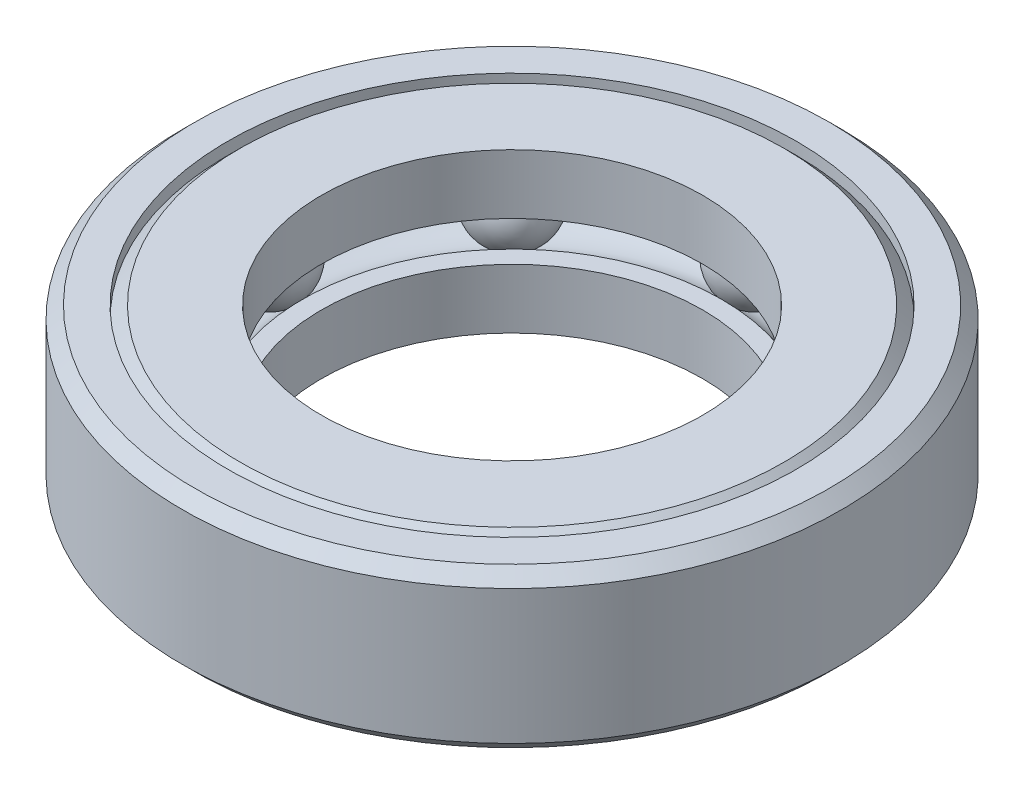
ISO-10303-21;
HEADER;
FILE_DESCRIPTION(('STEP AP214'),'2;1');
FILE_NAME('part.step','',(''),(''),'','','');
FILE_SCHEMA(('AUTOMOTIVE_DESIGN { 1 0 10303 214 1 1 1 1 }'));
ENDSEC;
DATA;
#1=APPLICATION_CONTEXT('core data for automotive mechanical design processes');
#2=APPLICATION_PROTOCOL_DEFINITION('international standard','automotive_design',2000,#1);
#3=PRODUCT_CONTEXT('',#1,'mechanical');
#4=PRODUCT('Part','Part','',(#3));
#5=PRODUCT_RELATED_PRODUCT_CATEGORY('part','',(#4));
#6=PRODUCT_DEFINITION_FORMATION('','',#4);
#7=PRODUCT_DEFINITION_CONTEXT('part definition',#1,'design');
#8=PRODUCT_DEFINITION('design','',#6,#7);
#9=PRODUCT_DEFINITION_SHAPE('','',#8);
#10=(LENGTH_UNIT() NAMED_UNIT(*) SI_UNIT(.MILLI.,.METRE.));
#11=(NAMED_UNIT(*) PLANE_ANGLE_UNIT() SI_UNIT($,.RADIAN.));
#12=(NAMED_UNIT(*) SI_UNIT($,.STERADIAN.) SOLID_ANGLE_UNIT());
#13=UNCERTAINTY_MEASURE_WITH_UNIT(LENGTH_MEASURE(1.E-05),#10,'distance_accuracy_value','');
#14=(GEOMETRIC_REPRESENTATION_CONTEXT(3) GLOBAL_UNCERTAINTY_ASSIGNED_CONTEXT((#13)) GLOBAL_UNIT_ASSIGNED_CONTEXT((#10,
#11,#12)) REPRESENTATION_CONTEXT('',''));
#15=CARTESIAN_POINT('',(0.,0.,0.));
#16=DIRECTION('',(0.,0.,1.));
#17=DIRECTION('',(1.,0.,0.));
#18=AXIS2_PLACEMENT_3D('',#15,#16,#17);
#19=CARTESIAN_POINT('',(17.2168347821121,0.,17.2168347821125));
#20=DIRECTION('',(0.,1.,0.));
#21=DIRECTION('',(-0.707106781186539,0.,-0.707106781186556));
#22=AXIS2_PLACEMENT_3D('',#19,#20,#21);
#23=SPHERICAL_SURFACE('',#22,3.96875);
#24=CARTESIAN_POINT('',(17.2168347821121,3.96875,17.2168347821125));
#25=VERTEX_POINT('',#24);
#26=VERTEX_LOOP('',#25);
#27=FACE_BOUND('',#26,.T.);
#28=ADVANCED_FACE('F38',(#27),#23,.T.);
#29=CLOSED_SHELL('',(#28));
#30=MANIFOLD_SOLID_BREP('B2',#29);
#31=CARTESIAN_POINT('',(24.34828125,0.,2.55034708851837E-13));
#32=DIRECTION('',(0.,1.,0.));
#33=DIRECTION('',(-1.,0.,0.));
#34=AXIS2_PLACEMENT_3D('',#31,#32,#33);
#35=SPHERICAL_SURFACE('',#34,3.96875);
#36=CARTESIAN_POINT('',(24.34828125,3.96875,2.55520740550249E-13));
#37=VERTEX_POINT('',#36);
#38=VERTEX_LOOP('',#37);
#39=FACE_BOUND('',#38,.T.);
#40=ADVANCED_FACE('F57',(#39),#35,.T.);
#41=CLOSED_SHELL('',(#40));
#42=MANIFOLD_SOLID_BREP('B6',#41);
#43=CARTESIAN_POINT('',(17.2168347821124,0.,-17.2168347821121));
#44=DIRECTION('',(0.,1.,0.));
#45=DIRECTION('',(-0.707106781186554,0.,0.707106781186541));
#46=AXIS2_PLACEMENT_3D('',#43,#44,#45);
#47=SPHERICAL_SURFACE('',#46,3.96875);
#48=CARTESIAN_POINT('',(17.2168347821124,3.96875000000001,-17.2168347821121));
#49=VERTEX_POINT('',#48);
#50=VERTEX_LOOP('',#49);
#51=FACE_BOUND('',#50,.T.);
#52=ADVANCED_FACE('F76',(#51),#47,.T.);
#53=CLOSED_SHELL('',(#52));
#54=MANIFOLD_SOLID_BREP('B34',#53);
#55=CARTESIAN_POINT('',(0.,0.,-24.34828125));
#56=DIRECTION('',(0.,1.,0.));
#57=DIRECTION('',(0.,0.,1.));
#58=AXIS2_PLACEMENT_3D('',#55,#56,#57);
#59=SPHERICAL_SURFACE('',#58,3.96875);
#60=CARTESIAN_POINT('',(0.,3.96875000000001,-24.34828125));
#61=VERTEX_POINT('',#60);
#62=VERTEX_LOOP('',#61);
#63=FACE_BOUND('',#62,.T.);
#64=ADVANCED_FACE('F95',(#63),#59,.T.);
#65=CLOSED_SHELL('',(#64));
#66=MANIFOLD_SOLID_BREP('B53',#65);
#67=CARTESIAN_POINT('',(-17.2168347821122,0.,-17.2168347821124));
#68=DIRECTION('',(0.,1.,0.));
#69=DIRECTION('',(0.707106781186544,0.,0.707106781186551));
#70=AXIS2_PLACEMENT_3D('',#67,#68,#69);
#71=SPHERICAL_SURFACE('',#70,3.96875);
#72=CARTESIAN_POINT('',(-17.2168347821122,3.96875000000001,-17.2168347821124));
#73=VERTEX_POINT('',#72);
#74=VERTEX_LOOP('',#73);
#75=FACE_BOUND('',#74,.T.);
#76=ADVANCED_FACE('F114',(#75),#71,.T.);
#77=CLOSED_SHELL('',(#76));
#78=MANIFOLD_SOLID_BREP('B72',#77);
#79=CARTESIAN_POINT('',(-24.34828125,0.,0.));
#80=DIRECTION('',(0.,1.,0.));
#81=DIRECTION('',(1.,0.,0.));
#82=AXIS2_PLACEMENT_3D('',#79,#80,#81);
#83=SPHERICAL_SURFACE('',#82,3.96875);
#84=CARTESIAN_POINT('',(-24.34828125,3.96875,0.));
#85=VERTEX_POINT('',#84);
#86=VERTEX_LOOP('',#85);
#87=FACE_BOUND('',#86,.T.);
#88=ADVANCED_FACE('F133',(#87),#83,.T.);
#89=CLOSED_SHELL('',(#88));
#90=MANIFOLD_SOLID_BREP('B91',#89);
#91=CARTESIAN_POINT('',(-17.2168347821123,0.,17.2168347821122));
#92=DIRECTION('',(0.,1.,0.));
#93=DIRECTION('',(0.707106781186549,0.,-0.707106781186546));
#94=AXIS2_PLACEMENT_3D('',#91,#92,#93);
#95=SPHERICAL_SURFACE('',#94,3.96875);
#96=CARTESIAN_POINT('',(-17.2168347821123,3.96875,17.2168347821122));
#97=VERTEX_POINT('',#96);
#98=VERTEX_LOOP('',#97);
#99=FACE_BOUND('',#98,.T.);
#100=ADVANCED_FACE('F152',(#99),#95,.T.);
#101=CLOSED_SHELL('',(#100));
#102=MANIFOLD_SOLID_BREP('B110',#101);
#103=CARTESIAN_POINT('',(0.,0.,24.34828125));
#104=DIRECTION('',(0.,1.,0.));
#105=DIRECTION('',(0.,0.,-1.));
#106=AXIS2_PLACEMENT_3D('',#103,#104,#105);
#107=SPHERICAL_SURFACE('',#106,3.96875);
#108=CARTESIAN_POINT('',(0.,3.96875,24.34828125));
#109=VERTEX_POINT('',#108);
#110=VERTEX_LOOP('',#109);
#111=FACE_BOUND('',#110,.T.);
#112=ADVANCED_FACE('F173',(#111),#107,.T.);
#113=CLOSED_SHELL('',(#112));
#114=MANIFOLD_SOLID_BREP('B129',#113);
#115=CARTESIAN_POINT('',(0.,5.47163488649767,0.));
#116=DIRECTION('',(0.,-1.,0.));
#117=DIRECTION('',(0.,0.,-1.));
#118=AXIS2_PLACEMENT_3D('',#115,#116,#117);
#119=CONICAL_SURFACE('',#118,29.6465625,0.785398163397453);
#120=CARTESIAN_POINT('',(0.,6.70456744324884,0.));
#121=DIRECTION('',(0.,-1.,0.));
#122=DIRECTION('',(0.,0.,-1.));
#123=AXIS2_PLACEMENT_3D('',#120,#121,#122);
#124=CIRCLE('',#123,28.4136299432488);
#125=CARTESIAN_POINT('',(0.,6.70456744324884,-28.4136299432488));
#126=VERTEX_POINT('',#125);
#127=EDGE_CURVE('E172',#126,#126,#124,.T.);
#128=ORIENTED_EDGE('',*,*,#127,.F.);
#129=EDGE_LOOP('',(#128));
#130=FACE_BOUND('',#129,.T.);
#131=CARTESIAN_POINT('',(0.,5.47163488649767,0.));
#132=DIRECTION('',(0.,-1.,0.));
#133=DIRECTION('',(0.,0.,-1.));
#134=AXIS2_PLACEMENT_3D('',#131,#132,#133);
#135=CIRCLE('',#134,29.6465625);
#136=CARTESIAN_POINT('',(0.,5.47163488649768,-29.6465625));
#137=VERTEX_POINT('',#136);
#138=EDGE_CURVE('E228',#137,#137,#135,.T.);
#139=ORIENTED_EDGE('',*,*,#138,.T.);
#140=EDGE_LOOP('',(#139));
#141=FACE_BOUND('',#140,.T.);
#142=ADVANCED_FACE('F194',(#130,#141),#119,.F.);
#143=CARTESIAN_POINT('',(0.,-7.9375,0.));
#144=DIRECTION('',(0.,-1.,0.));
#145=DIRECTION('',(0.,0.,-1.));
#146=AXIS2_PLACEMENT_3D('',#143,#144,#145);
#147=CYLINDRICAL_SURFACE('',#146,28.4136299432488);
#148=CARTESIAN_POINT('',(0.,7.9375,0.));
#149=DIRECTION('',(0.,-1.,0.));
#150=DIRECTION('',(0.,0.,-1.));
#151=AXIS2_PLACEMENT_3D('',#148,#149,#150);
#152=CIRCLE('',#151,28.4136299432488);
#153=CARTESIAN_POINT('',(0.,7.93750000000001,-28.4136299432488));
#154=VERTEX_POINT('',#153);
#155=EDGE_CURVE('E200',#154,#154,#152,.T.);
#156=ORIENTED_EDGE('',*,*,#155,.F.);
#157=EDGE_LOOP('',(#156));
#158=FACE_BOUND('',#157,.T.);
#159=ORIENTED_EDGE('',*,*,#127,.T.);
#160=EDGE_LOOP('',(#159));
#161=FACE_BOUND('',#160,.T.);
#162=ADVANCED_FACE('F277',(#158,#161),#147,.F.);
#163=CARTESIAN_POINT('',(0.,7.9375,31.7076924432488));
#164=DIRECTION('',(0.,-1.,0.));
#165=DIRECTION('',(0.,0.,-1.));
#166=AXIS2_PLACEMENT_3D('',#163,#164,#165);
#167=PLANE('',#166);
#168=CARTESIAN_POINT('',(0.,7.9375,0.));
#169=DIRECTION('',(0.,-1.,0.));
#170=DIRECTION('',(0.,0.,-1.));
#171=AXIS2_PLACEMENT_3D('',#168,#169,#170);
#172=CIRCLE('',#171,31.7076924432488);
#173=CARTESIAN_POINT('',(0.,7.93750000000001,-31.7076924432488));
#174=VERTEX_POINT('',#173);
#175=EDGE_CURVE('E204',#174,#174,#172,.T.);
#176=ORIENTED_EDGE('',*,*,#175,.F.);
#177=EDGE_LOOP('',(#176));
#178=FACE_BOUND('',#177,.T.);
#179=ORIENTED_EDGE('',*,*,#155,.T.);
#180=EDGE_LOOP('',(#179));
#181=FACE_BOUND('',#180,.T.);
#182=ADVANCED_FACE('F272',(#178,#181),#167,.F.);
#183=CARTESIAN_POINT('',(0.,7.9375,0.));
#184=DIRECTION('',(0.,-1.,0.));
#185=DIRECTION('',(0.,0.,-1.));
#186=AXIS2_PLACEMENT_3D('',#183,#184,#185);
#187=CONICAL_SURFACE('',#186,31.7076924432488,0.785398163397452);
#188=CARTESIAN_POINT('',(0.,6.70456744324884,0.));
#189=DIRECTION('',(0.,-1.,0.));
#190=DIRECTION('',(0.,0.,-1.));
#191=AXIS2_PLACEMENT_3D('',#188,#189,#190);
#192=CIRCLE('',#191,32.940625);
#193=CARTESIAN_POINT('',(0.,6.70456744324884,-32.940625));
#194=VERTEX_POINT('',#193);
#195=EDGE_CURVE('E208',#194,#194,#192,.T.);
#196=ORIENTED_EDGE('',*,*,#195,.F.);
#197=EDGE_LOOP('',(#196));
#198=FACE_BOUND('',#197,.T.);
#199=ORIENTED_EDGE('',*,*,#175,.T.);
#200=EDGE_LOOP('',(#199));
#201=FACE_BOUND('',#200,.T.);
#202=ADVANCED_FACE('F266',(#198,#201),#187,.T.);
#203=CARTESIAN_POINT('',(0.,-7.9375,0.));
#204=DIRECTION('',(0.,-1.,0.));
#205=DIRECTION('',(0.,0.,-1.));
#206=AXIS2_PLACEMENT_3D('',#203,#204,#205);
#207=CYLINDRICAL_SURFACE('',#206,32.940625);
#208=CARTESIAN_POINT('',(0.,-6.70456744324886,0.));
#209=DIRECTION('',(0.,-1.,0.));
#210=DIRECTION('',(0.,0.,-1.));
#211=AXIS2_PLACEMENT_3D('',#208,#209,#210);
#212=CIRCLE('',#211,32.940625);
#213=CARTESIAN_POINT('',(0.,-6.70456744324885,-32.940625));
#214=VERTEX_POINT('',#213);
#215=EDGE_CURVE('E213',#214,#214,#212,.T.);
#216=ORIENTED_EDGE('',*,*,#215,.F.);
#217=EDGE_LOOP('',(#216));
#218=FACE_BOUND('',#217,.T.);
#219=ORIENTED_EDGE('',*,*,#195,.T.);
#220=EDGE_LOOP('',(#219));
#221=FACE_BOUND('',#220,.T.);
#222=ADVANCED_FACE('F260',(#218,#221),#207,.T.);
#223=CARTESIAN_POINT('',(0.,-6.70456744324886,0.));
#224=DIRECTION('',(0.,1.,0.));
#225=DIRECTION('',(0.,0.,1.));
#226=AXIS2_PLACEMENT_3D('',#223,#224,#225);
#227=CONICAL_SURFACE('',#226,32.940625,0.785398163397451);
#228=CARTESIAN_POINT('',(0.,-7.93750000000002,0.));
#229=DIRECTION('',(0.,-1.,0.));
#230=DIRECTION('',(0.,0.,-1.));
#231=AXIS2_PLACEMENT_3D('',#228,#229,#230);
#232=CIRCLE('',#231,31.7076924432488);
#233=CARTESIAN_POINT('',(0.,-7.93750000000002,-31.7076924432488));
#234=VERTEX_POINT('',#233);
#235=EDGE_CURVE('E216',#234,#234,#232,.T.);
#236=ORIENTED_EDGE('',*,*,#235,.F.);
#237=EDGE_LOOP('',(#236));
#238=FACE_BOUND('',#237,.T.);
#239=ORIENTED_EDGE('',*,*,#215,.T.);
#240=EDGE_LOOP('',(#239));
#241=FACE_BOUND('',#240,.T.);
#242=ADVANCED_FACE('F254',(#238,#241),#227,.T.);
#243=CARTESIAN_POINT('',(0.,-7.93750000000002,31.7076924432488));
#244=DIRECTION('',(0.,1.,0.));
#245=DIRECTION('',(0.,0.,1.));
#246=AXIS2_PLACEMENT_3D('',#243,#244,#245);
#247=PLANE('',#246);
#248=CARTESIAN_POINT('',(0.,-7.93750000000002,0.));
#249=DIRECTION('',(0.,-1.,0.));
#250=DIRECTION('',(0.,0.,-1.));
#251=AXIS2_PLACEMENT_3D('',#248,#249,#250);
#252=CIRCLE('',#251,28.4136299432488);
#253=CARTESIAN_POINT('',(0.,-7.93750000000001,-28.4136299432488));
#254=VERTEX_POINT('',#253);
#255=EDGE_CURVE('E219',#254,#254,#252,.T.);
#256=ORIENTED_EDGE('',*,*,#255,.F.);
#257=EDGE_LOOP('',(#256));
#258=FACE_BOUND('',#257,.T.);
#259=ORIENTED_EDGE('',*,*,#235,.T.);
#260=EDGE_LOOP('',(#259));
#261=FACE_BOUND('',#260,.T.);
#262=ADVANCED_FACE('F248',(#258,#261),#247,.F.);
#263=CARTESIAN_POINT('',(0.,-7.9375,0.));
#264=DIRECTION('',(0.,-1.,0.));
#265=DIRECTION('',(0.,0.,-1.));
#266=AXIS2_PLACEMENT_3D('',#263,#264,#265);
#267=CYLINDRICAL_SURFACE('',#266,28.4136299432488);
#268=CARTESIAN_POINT('',(0.,-6.70456744324886,0.));
#269=DIRECTION('',(0.,-1.,0.));
#270=DIRECTION('',(0.,0.,-1.));
#271=AXIS2_PLACEMENT_3D('',#268,#269,#270);
#272=CIRCLE('',#271,28.4136299432488);
#273=CARTESIAN_POINT('',(0.,-6.70456744324885,-28.4136299432488));
#274=VERTEX_POINT('',#273);
#275=EDGE_CURVE('E222',#274,#274,#272,.T.);
#276=ORIENTED_EDGE('',*,*,#275,.F.);
#277=EDGE_LOOP('',(#276));
#278=FACE_BOUND('',#277,.T.);
#279=ORIENTED_EDGE('',*,*,#255,.T.);
#280=EDGE_LOOP('',(#279));
#281=FACE_BOUND('',#280,.T.);
#282=ADVANCED_FACE('F242',(#278,#281),#267,.F.);
#283=CARTESIAN_POINT('',(0.,-6.70456744324886,0.));
#284=DIRECTION('',(0.,1.,0.));
#285=DIRECTION('',(0.,0.,1.));
#286=AXIS2_PLACEMENT_3D('',#283,#284,#285);
#287=CONICAL_SURFACE('',#286,28.4136299432488,0.785398163397447);
#288=CARTESIAN_POINT('',(0.,-5.47163488649768,0.));
#289=DIRECTION('',(0.,-1.,0.));
#290=DIRECTION('',(0.,0.,-1.));
#291=AXIS2_PLACEMENT_3D('',#288,#289,#290);
#292=CIRCLE('',#291,29.6465625);
#293=CARTESIAN_POINT('',(0.,-5.47163488649767,-29.6465625));
#294=VERTEX_POINT('',#293);
#295=EDGE_CURVE('E225',#294,#294,#292,.T.);
#296=ORIENTED_EDGE('',*,*,#295,.F.);
#297=EDGE_LOOP('',(#296));
#298=FACE_BOUND('',#297,.T.);
#299=ORIENTED_EDGE('',*,*,#275,.T.);
#300=EDGE_LOOP('',(#299));
#301=FACE_BOUND('',#300,.T.);
#302=ADVANCED_FACE('F236',(#298,#301),#287,.F.);
#303=CARTESIAN_POINT('',(0.,-7.9375,0.));
#304=DIRECTION('',(0.,-1.,0.));
#305=DIRECTION('',(0.,0.,-1.));
#306=AXIS2_PLACEMENT_3D('',#303,#304,#305);
#307=CYLINDRICAL_SURFACE('',#306,29.6465625);
#308=ORIENTED_EDGE('',*,*,#138,.F.);
#309=EDGE_LOOP('',(#308));
#310=FACE_BOUND('',#309,.T.);
#311=ORIENTED_EDGE('',*,*,#295,.T.);
#312=EDGE_LOOP('',(#311));
#313=FACE_BOUND('',#312,.T.);
#314=ADVANCED_FACE('F233',(#310,#313),#307,.F.);
#315=CLOSED_SHELL('',(#142,#162,#182,#202,#222,#242,#262,#282,#302,#314));
#316=MANIFOLD_SOLID_BREP('B148',#315);
#317=CARTESIAN_POINT('',(0.,0.,0.));
#318=DIRECTION('',(0.,-1.,0.));
#319=DIRECTION('',(0.,0.,-1.));
#320=AXIS2_PLACEMENT_3D('',#317,#318,#319);
#321=TOROIDAL_SURFACE('',#320,24.34828125,3.96875000000001);
#322=CARTESIAN_POINT('',(0.,-1.98437500000002,0.));
#323=DIRECTION('',(0.,-1.,0.));
#324=DIRECTION('',(0.,0.,-1.));
#325=AXIS2_PLACEMENT_3D('',#322,#323,#324);
#326=CIRCLE('',#325,27.7853195712695);
#327=CARTESIAN_POINT('',(0.,-1.98437500000001,-27.7853195712695));
#328=VERTEX_POINT('',#327);
#329=EDGE_CURVE('E193',#328,#328,#326,.T.);
#330=ORIENTED_EDGE('',*,*,#329,.F.);
#331=EDGE_LOOP('',(#330));
#332=FACE_BOUND('',#331,.T.);
#333=CARTESIAN_POINT('',(0.,-1.98437500000002,0.));
#334=DIRECTION('',(0.,-1.,0.));
#335=DIRECTION('',(0.,0.,-1.));
#336=AXIS2_PLACEMENT_3D('',#333,#334,#335);
#337=CIRCLE('',#336,20.9112429287305);
#338=CARTESIAN_POINT('',(0.,-1.98437500000001,-20.9112429287305));
#339=VERTEX_POINT('',#338);
#340=EDGE_CURVE('E378',#339,#339,#337,.T.);
#341=ORIENTED_EDGE('',*,*,#340,.T.);
#342=EDGE_LOOP('',(#341));
#343=FACE_BOUND('',#342,.T.);
#344=ADVANCED_FACE('F353',(#332,#343),#321,.F.);
#345=CARTESIAN_POINT('',(0.,-1.98437500000002,27.7853195712695));
#346=DIRECTION('',(0.,-1.,0.));
#347=DIRECTION('',(0.,0.,-1.));
#348=AXIS2_PLACEMENT_3D('',#345,#346,#347);
#349=PLANE('',#348);
#350=CARTESIAN_POINT('',(0.,-1.98437500000002,0.));
#351=DIRECTION('',(0.,-1.,0.));
#352=DIRECTION('',(0.,0.,-1.));
#353=AXIS2_PLACEMENT_3D('',#350,#351,#352);
#354=CIRCLE('',#353,29.6465625);
#355=CARTESIAN_POINT('',(0.,-1.98437500000002,-29.6465625));
#356=VERTEX_POINT('',#355);
#357=EDGE_CURVE('E359',#356,#356,#354,.T.);
#358=ORIENTED_EDGE('',*,*,#357,.F.);
#359=EDGE_LOOP('',(#358));
#360=FACE_BOUND('',#359,.T.);
#361=ORIENTED_EDGE('',*,*,#329,.T.);
#362=EDGE_LOOP('',(#361));
#363=FACE_BOUND('',#362,.T.);
#364=ADVANCED_FACE('F409',(#360,#363),#349,.F.);
#365=CARTESIAN_POINT('',(0.,-7.9375,0.));
#366=DIRECTION('',(0.,-1.,0.));
#367=DIRECTION('',(0.,0.,-1.));
#368=AXIS2_PLACEMENT_3D('',#365,#366,#367);
#369=CYLINDRICAL_SURFACE('',#368,29.6465625);
#370=CARTESIAN_POINT('',(0.,-5.47163488649769,0.));
#371=DIRECTION('',(0.,-1.,0.));
#372=DIRECTION('',(0.,0.,-1.));
#373=AXIS2_PLACEMENT_3D('',#370,#371,#372);
#374=CIRCLE('',#373,29.6465625);
#375=CARTESIAN_POINT('',(0.,-5.47163488649769,-29.6465625));
#376=VERTEX_POINT('',#375);
#377=EDGE_CURVE('E363',#376,#376,#374,.T.);
#378=ORIENTED_EDGE('',*,*,#377,.F.);
#379=EDGE_LOOP('',(#378));
#380=FACE_BOUND('',#379,.T.);
#381=ORIENTED_EDGE('',*,*,#357,.T.);
#382=EDGE_LOOP('',(#381));
#383=FACE_BOUND('',#382,.T.);
#384=ADVANCED_FACE('F404',(#380,#383),#369,.T.);
#385=CARTESIAN_POINT('',(0.,-5.47163488649769,0.));
#386=DIRECTION('',(0.,1.,0.));
#387=DIRECTION('',(0.,0.,1.));
#388=AXIS2_PLACEMENT_3D('',#385,#386,#387);
#389=CONICAL_SURFACE('',#388,29.6465625,0.78539816339745);
#390=CARTESIAN_POINT('',(0.,-7.93750000000002,0.));
#391=DIRECTION('',(0.,-1.,0.));
#392=DIRECTION('',(0.,0.,-1.));
#393=AXIS2_PLACEMENT_3D('',#390,#391,#392);
#394=CIRCLE('',#393,27.1806973864977);
#395=CARTESIAN_POINT('',(0.,-7.93750000000001,-27.1806973864977));
#396=VERTEX_POINT('',#395);
#397=EDGE_CURVE('E367',#396,#396,#394,.T.);
#398=ORIENTED_EDGE('',*,*,#397,.F.);
#399=EDGE_LOOP('',(#398));
#400=FACE_BOUND('',#399,.T.);
#401=ORIENTED_EDGE('',*,*,#377,.T.);
#402=EDGE_LOOP('',(#401));
#403=FACE_BOUND('',#402,.T.);
#404=ADVANCED_FACE('F398',(#400,#403),#389,.T.);
#405=CARTESIAN_POINT('',(0.,-7.93750000000001,27.1806973864977));
#406=DIRECTION('',(0.,1.,0.));
#407=DIRECTION('',(0.,0.,1.));
#408=AXIS2_PLACEMENT_3D('',#405,#406,#407);
#409=PLANE('',#408);
#410=CARTESIAN_POINT('',(0.,-7.93750000000001,0.));
#411=DIRECTION('',(0.,-1.,0.));
#412=DIRECTION('',(0.,0.,-1.));
#413=AXIS2_PLACEMENT_3D('',#410,#411,#412);
#414=CIRCLE('',#413,19.05);
#415=CARTESIAN_POINT('',(0.,-7.93750000000001,-19.05));
#416=VERTEX_POINT('',#415);
#417=EDGE_CURVE('E372',#416,#416,#414,.T.);
#418=ORIENTED_EDGE('',*,*,#417,.F.);
#419=EDGE_LOOP('',(#418));
#420=FACE_BOUND('',#419,.T.);
#421=ORIENTED_EDGE('',*,*,#397,.T.);
#422=EDGE_LOOP('',(#421));
#423=FACE_BOUND('',#422,.T.);
#424=ADVANCED_FACE('F392',(#420,#423),#409,.F.);
#425=CARTESIAN_POINT('',(0.,-7.9375,0.));
#426=DIRECTION('',(0.,-1.,0.));
#427=DIRECTION('',(0.,0.,-1.));
#428=AXIS2_PLACEMENT_3D('',#425,#426,#427);
#429=CYLINDRICAL_SURFACE('',#428,19.05);
#430=CARTESIAN_POINT('',(0.,-1.98437500000002,0.));
#431=DIRECTION('',(0.,-1.,0.));
#432=DIRECTION('',(0.,0.,-1.));
#433=AXIS2_PLACEMENT_3D('',#430,#431,#432);
#434=CIRCLE('',#433,19.05);
#435=CARTESIAN_POINT('',(0.,-1.98437500000001,-19.05));
#436=VERTEX_POINT('',#435);
#437=EDGE_CURVE('E375',#436,#436,#434,.T.);
#438=ORIENTED_EDGE('',*,*,#437,.F.);
#439=EDGE_LOOP('',(#438));
#440=FACE_BOUND('',#439,.T.);
#441=ORIENTED_EDGE('',*,*,#417,.T.);
#442=EDGE_LOOP('',(#441));
#443=FACE_BOUND('',#442,.T.);
#444=ADVANCED_FACE('F386',(#440,#443),#429,.F.);
#445=CARTESIAN_POINT('',(0.,-1.98437500000002,19.05));
#446=DIRECTION('',(0.,-1.,0.));
#447=DIRECTION('',(0.,0.,-1.));
#448=AXIS2_PLACEMENT_3D('',#445,#446,#447);
#449=PLANE('',#448);
#450=ORIENTED_EDGE('',*,*,#340,.F.);
#451=EDGE_LOOP('',(#450));
#452=FACE_BOUND('',#451,.T.);
#453=ORIENTED_EDGE('',*,*,#437,.T.);
#454=EDGE_LOOP('',(#453));
#455=FACE_BOUND('',#454,.T.);
#456=ADVANCED_FACE('F383',(#452,#455),#449,.F.);
#457=CLOSED_SHELL('',(#344,#364,#384,#404,#424,#444,#456));
#458=MANIFOLD_SOLID_BREP('B167',#457);
#459=CARTESIAN_POINT('',(0.,0.,0.));
#460=DIRECTION('',(0.,-1.,0.));
#461=DIRECTION('',(0.,0.,-1.));
#462=AXIS2_PLACEMENT_3D('',#459,#460,#461);
#463=TOROIDAL_SURFACE('',#462,24.34828125,3.96875);
#464=CARTESIAN_POINT('',(0.,1.984375,0.));
#465=DIRECTION('',(0.,-1.,0.));
#466=DIRECTION('',(0.,0.,-1.));
#467=AXIS2_PLACEMENT_3D('',#464,#465,#466);
#468=CIRCLE('',#467,20.9112429287305);
#469=CARTESIAN_POINT('',(0.,1.984375,-20.9112429287305));
#470=VERTEX_POINT('',#469);
#471=EDGE_CURVE('E485',#470,#470,#468,.T.);
#472=ORIENTED_EDGE('',*,*,#471,.F.);
#473=EDGE_LOOP('',(#472));
#474=FACE_BOUND('',#473,.T.);
#475=CARTESIAN_POINT('',(0.,1.984375,0.));
#476=DIRECTION('',(0.,-1.,0.));
#477=DIRECTION('',(0.,0.,-1.));
#478=AXIS2_PLACEMENT_3D('',#475,#476,#477);
#479=CIRCLE('',#478,27.7853195712695);
#480=CARTESIAN_POINT('',(0.,1.98437500000001,-27.7853195712695));
#481=VERTEX_POINT('',#480);
#482=EDGE_CURVE('E352',#481,#481,#479,.T.);
#483=ORIENTED_EDGE('',*,*,#482,.T.);
#484=EDGE_LOOP('',(#483));
#485=FACE_BOUND('',#484,.T.);
#486=ADVANCED_FACE('F460',(#474,#485),#463,.F.);
#487=CARTESIAN_POINT('',(0.,1.984375,27.7853195712695));
#488=DIRECTION('',(0.,1.,0.));
#489=DIRECTION('',(0.,0.,1.));
#490=AXIS2_PLACEMENT_3D('',#487,#488,#489);
#491=PLANE('',#490);
#492=ORIENTED_EDGE('',*,*,#482,.F.);
#493=EDGE_LOOP('',(#492));
#494=FACE_BOUND('',#493,.T.);
#495=CARTESIAN_POINT('',(0.,1.984375,0.));
#496=DIRECTION('',(0.,-1.,0.));
#497=DIRECTION('',(0.,0.,-1.));
#498=AXIS2_PLACEMENT_3D('',#495,#496,#497);
#499=CIRCLE('',#498,29.6465625);
#500=CARTESIAN_POINT('',(0.,1.98437500000001,-29.6465625));
#501=VERTEX_POINT('',#500);
#502=EDGE_CURVE('E466',#501,#501,#499,.T.);
#503=ORIENTED_EDGE('',*,*,#502,.T.);
#504=EDGE_LOOP('',(#503));
#505=FACE_BOUND('',#504,.T.);
#506=ADVANCED_FACE('F492',(#494,#505),#491,.F.);
#507=CARTESIAN_POINT('',(0.,-7.9375,0.));
#508=DIRECTION('',(0.,-1.,0.));
#509=DIRECTION('',(0.,0.,-1.));
#510=AXIS2_PLACEMENT_3D('',#507,#508,#509);
#511=CYLINDRICAL_SURFACE('',#510,29.6465625);
#512=ORIENTED_EDGE('',*,*,#502,.F.);
#513=EDGE_LOOP('',(#512));
#514=FACE_BOUND('',#513,.T.);
#515=CARTESIAN_POINT('',(0.,5.47163488649767,0.));
#516=DIRECTION('',(0.,-1.,0.));
#517=DIRECTION('',(0.,0.,-1.));
#518=AXIS2_PLACEMENT_3D('',#515,#516,#517);
#519=CIRCLE('',#518,29.6465625);
#520=CARTESIAN_POINT('',(0.,5.47163488649768,-29.6465625));
#521=VERTEX_POINT('',#520);
#522=EDGE_CURVE('E470',#521,#521,#519,.T.);
#523=ORIENTED_EDGE('',*,*,#522,.T.);
#524=EDGE_LOOP('',(#523));
#525=FACE_BOUND('',#524,.T.);
#526=ADVANCED_FACE('F496',(#514,#525),#511,.T.);
#527=CARTESIAN_POINT('',(0.,7.9375,0.));
#528=DIRECTION('',(0.,-1.,0.));
#529=DIRECTION('',(0.,0.,-1.));
#530=AXIS2_PLACEMENT_3D('',#527,#528,#529);
#531=CONICAL_SURFACE('',#530,27.1806973864977,0.78539816339745);
#532=ORIENTED_EDGE('',*,*,#522,.F.);
#533=EDGE_LOOP('',(#532));
#534=FACE_BOUND('',#533,.T.);
#535=CARTESIAN_POINT('',(0.,7.9375,0.));
#536=DIRECTION('',(0.,-1.,0.));
#537=DIRECTION('',(0.,0.,-1.));
#538=AXIS2_PLACEMENT_3D('',#535,#536,#537);
#539=CIRCLE('',#538,27.1806973864977);
#540=CARTESIAN_POINT('',(0.,7.93750000000001,-27.1806973864977));
#541=VERTEX_POINT('',#540);
#542=EDGE_CURVE('E474',#541,#541,#539,.T.);
#543=ORIENTED_EDGE('',*,*,#542,.T.);
#544=EDGE_LOOP('',(#543));
#545=FACE_BOUND('',#544,.T.);
#546=ADVANCED_FACE('F501',(#534,#545),#531,.T.);
#547=CARTESIAN_POINT('',(0.,7.93749999999999,27.1806973864977));
#548=DIRECTION('',(0.,-1.,0.));
#549=DIRECTION('',(0.,0.,-1.));
#550=AXIS2_PLACEMENT_3D('',#547,#548,#549);
#551=PLANE('',#550);
#552=ORIENTED_EDGE('',*,*,#542,.F.);
#553=EDGE_LOOP('',(#552));
#554=FACE_BOUND('',#553,.T.);
#555=CARTESIAN_POINT('',(0.,7.93749999999999,0.));
#556=DIRECTION('',(0.,-1.,0.));
#557=DIRECTION('',(0.,0.,-1.));
#558=AXIS2_PLACEMENT_3D('',#555,#556,#557);
#559=CIRCLE('',#558,19.05);
#560=CARTESIAN_POINT('',(0.,7.93749999999999,-19.05));
#561=VERTEX_POINT('',#560);
#562=EDGE_CURVE('E479',#561,#561,#559,.T.);
#563=ORIENTED_EDGE('',*,*,#562,.T.);
#564=EDGE_LOOP('',(#563));
#565=FACE_BOUND('',#564,.T.);
#566=ADVANCED_FACE('F507',(#554,#565),#551,.F.);
#567=CARTESIAN_POINT('',(0.,-7.9375,0.));
#568=DIRECTION('',(0.,-1.,0.));
#569=DIRECTION('',(0.,0.,-1.));
#570=AXIS2_PLACEMENT_3D('',#567,#568,#569);
#571=CYLINDRICAL_SURFACE('',#570,19.05);
#572=ORIENTED_EDGE('',*,*,#562,.F.);
#573=EDGE_LOOP('',(#572));
#574=FACE_BOUND('',#573,.T.);
#575=CARTESIAN_POINT('',(0.,1.984375,0.));
#576=DIRECTION('',(0.,-1.,0.));
#577=DIRECTION('',(0.,0.,-1.));
#578=AXIS2_PLACEMENT_3D('',#575,#576,#577);
#579=CIRCLE('',#578,19.05);
#580=CARTESIAN_POINT('',(0.,1.984375,-19.05));
#581=VERTEX_POINT('',#580);
#582=EDGE_CURVE('E482',#581,#581,#579,.T.);
#583=ORIENTED_EDGE('',*,*,#582,.T.);
#584=EDGE_LOOP('',(#583));
#585=FACE_BOUND('',#584,.T.);
#586=ADVANCED_FACE('F511',(#574,#585),#571,.F.);
#587=CARTESIAN_POINT('',(0.,1.984375,19.05));
#588=DIRECTION('',(0.,1.,0.));
#589=DIRECTION('',(0.,0.,1.));
#590=AXIS2_PLACEMENT_3D('',#587,#588,#589);
#591=PLANE('',#590);
#592=ORIENTED_EDGE('',*,*,#582,.F.);
#593=EDGE_LOOP('',(#592));
#594=FACE_BOUND('',#593,.T.);
#595=ORIENTED_EDGE('',*,*,#471,.T.);
#596=EDGE_LOOP('',(#595));
#597=FACE_BOUND('',#596,.T.);
#598=ADVANCED_FACE('F489',(#594,#597),#591,.F.);
#599=CLOSED_SHELL('',(#486,#506,#526,#546,#566,#586,#598));
#600=MANIFOLD_SOLID_BREP('B188',#599);
#601=ADVANCED_BREP_SHAPE_REPRESENTATION('',(#18,#30,#42,#54,#66,#78,#90,#102,#114,#316,#458,
#600),#14);
#602=SHAPE_DEFINITION_REPRESENTATION(#9,#601);
ENDSEC;
END-ISO-10303-21;
